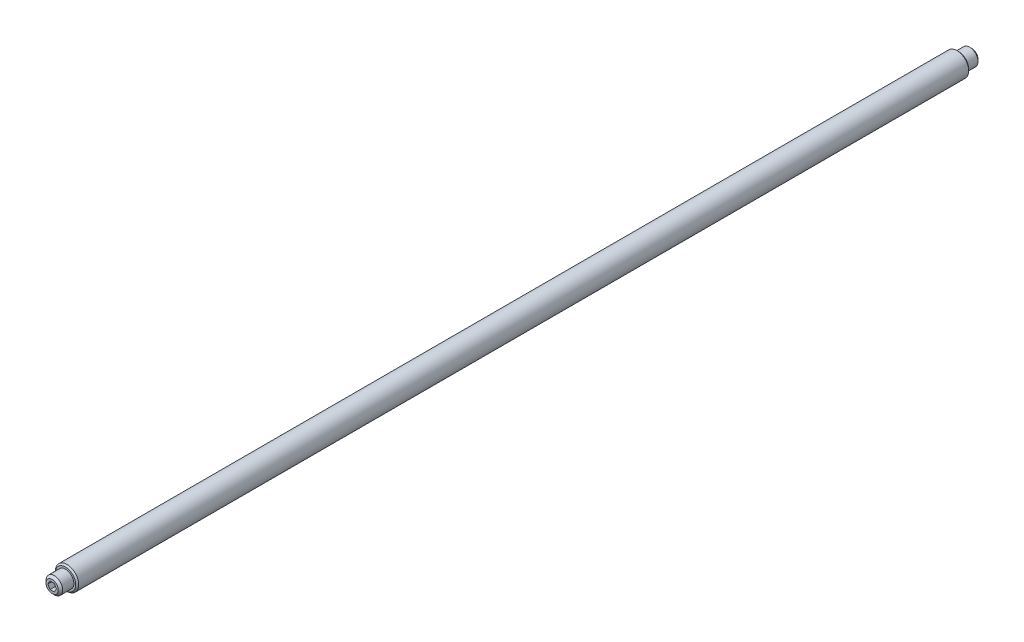
ISO-10303-21;
HEADER;
FILE_DESCRIPTION(('STEP AP214'),'2;1');
FILE_NAME('part.step','',(''),(''),'','','');
FILE_SCHEMA(('AUTOMOTIVE_DESIGN { 1 0 10303 214 1 1 1 1 }'));
ENDSEC;
DATA;
#1=APPLICATION_CONTEXT('core data for automotive mechanical design processes');
#2=APPLICATION_PROTOCOL_DEFINITION('international standard','automotive_design',2000,#1);
#3=PRODUCT_CONTEXT('',#1,'mechanical');
#4=PRODUCT('Part','Part','',(#3));
#5=PRODUCT_RELATED_PRODUCT_CATEGORY('part','',(#4));
#6=PRODUCT_DEFINITION_FORMATION('','',#4);
#7=PRODUCT_DEFINITION_CONTEXT('part definition',#1,'design');
#8=PRODUCT_DEFINITION('design','',#6,#7);
#9=PRODUCT_DEFINITION_SHAPE('','',#8);
#10=(LENGTH_UNIT() NAMED_UNIT(*) SI_UNIT(.MILLI.,.METRE.));
#11=(NAMED_UNIT(*) PLANE_ANGLE_UNIT() SI_UNIT($,.RADIAN.));
#12=(NAMED_UNIT(*) SI_UNIT($,.STERADIAN.) SOLID_ANGLE_UNIT());
#13=UNCERTAINTY_MEASURE_WITH_UNIT(LENGTH_MEASURE(1.E-05),#10,'distance_accuracy_value','');
#14=(GEOMETRIC_REPRESENTATION_CONTEXT(3) GLOBAL_UNCERTAINTY_ASSIGNED_CONTEXT((#13)) GLOBAL_UNIT_ASSIGNED_CONTEXT((#10,
#11,#12)) REPRESENTATION_CONTEXT('',''));
#15=CARTESIAN_POINT('',(0.,0.,0.));
#16=DIRECTION('',(0.,0.,1.));
#17=DIRECTION('',(1.,0.,0.));
#18=AXIS2_PLACEMENT_3D('',#15,#16,#17);
#19=CARTESIAN_POINT('',(0.,0.,-78.486));
#20=DIRECTION('',(0.,0.,-1.));
#21=DIRECTION('',(-0.998913283373913,-0.0466074275105245,0.));
#22=AXIS2_PLACEMENT_3D('',#19,#20,#21);
#23=PLANE('',#22);
#24=CARTESIAN_POINT('',(0.,0.,-78.486));
#25=DIRECTION('',(0.,0.,-1.));
#26=DIRECTION('',(-0.998913283373913,-0.0466074275105245,0.));
#27=AXIS2_PLACEMENT_3D('',#24,#25,#26);
#28=CIRCLE('',#27,1.04394);
#29=CARTESIAN_POINT('',(-1.04280553304536,-0.048655357875337,-78.486));
#30=VERTEX_POINT('',#29);
#31=EDGE_CURVE('P0_E11',#30,#30,#28,.T.);
#32=ORIENTED_EDGE('',*,*,#31,.T.);
#33=EDGE_LOOP('',(#32));
#34=FACE_BOUND('',#33,.T.);
#35=DIRECTION('',(0.998913283373913,0.0466074275105243,0.));
#36=VECTOR('',#35,1.);
#37=CARTESIAN_POINT('',(-0.395814728157853,0.617222840072096,-78.486));
#38=LINE('',#37,#36);
#39=CARTESIAN_POINT('',(-0.395814728157853,0.617222840072096,-78.486));
#40=VERTEX_POINT('',#39);
#41=CARTESIAN_POINT('',(0.336623295219484,0.651397029812781,-78.486));
#42=VERTEX_POINT('',#41);
#43=EDGE_CURVE('P0_E78',#40,#42,#38,.T.);
#44=ORIENTED_EDGE('',*,*,#43,.F.);
#45=DIRECTION('',(-0.459093425457801,-0.888387993334794,0.));
#46=VECTOR('',#45,1.);
#47=CARTESIAN_POINT('',(-0.395814728157853,0.617222840072096,-78.486));
#48=LINE('',#47,#46);
#49=CARTESIAN_POINT('',(-0.732438023377339,-0.034174189740681,-78.486));
#50=VERTEX_POINT('',#49);
#51=EDGE_CURVE('P0_E31',#40,#50,#48,.T.);
#52=ORIENTED_EDGE('',*,*,#51,.T.);
#53=DIRECTION('',(-0.539819857916113,0.84178056582427,0.));
#54=VECTOR('',#53,1.);
#55=CARTESIAN_POINT('',(-0.336623295219487,-0.651397029812773,-78.486));
#56=LINE('',#55,#54);
#57=CARTESIAN_POINT('',(-0.336623295219487,-0.651397029812773,-78.486));
#58=VERTEX_POINT('',#57);
#59=EDGE_CURVE('P0_E84',#58,#50,#56,.T.);
#60=ORIENTED_EDGE('',*,*,#59,.F.);
#61=DIRECTION('',(0.998913283373913,0.0466074275105245,0.));
#62=VECTOR('',#61,1.);
#63=CARTESIAN_POINT('',(-0.336623295219487,-0.651397029812773,-78.486));
#64=LINE('',#63,#62);
#65=CARTESIAN_POINT('',(0.395814728157851,-0.617222840072088,-78.486));
#66=VERTEX_POINT('',#65);
#67=EDGE_CURVE('P0_E104',#58,#66,#64,.T.);
#68=ORIENTED_EDGE('',*,*,#67,.T.);
#69=DIRECTION('',(0.459093425457801,0.888387993334794,0.));
#70=VECTOR('',#69,1.);
#71=CARTESIAN_POINT('',(0.395814728157851,-0.617222840072088,-78.486));
#72=LINE('',#71,#70);
#73=CARTESIAN_POINT('',(0.732438023377336,0.0341741897406895,-78.486));
#74=VERTEX_POINT('',#73);
#75=EDGE_CURVE('P0_E107',#66,#74,#72,.T.);
#76=ORIENTED_EDGE('',*,*,#75,.T.);
#77=DIRECTION('',(0.539819857916113,-0.84178056582427,0.));
#78=VECTOR('',#77,1.);
#79=CARTESIAN_POINT('',(0.336623295219484,0.651397029812781,-78.486));
#80=LINE('',#79,#78);
#81=EDGE_CURVE('P0_E110',#42,#74,#80,.T.);
#82=ORIENTED_EDGE('',*,*,#81,.F.);
#83=EDGE_LOOP('',(#44,#52,#60,#68,#76,#82));
#84=FACE_BOUND('',#83,.T.);
#85=ADVANCED_FACE('P0_F17',(#34,#84),#23,.T.);
#86=CARTESIAN_POINT('',(0.,0.,-78.486));
#87=DIRECTION('',(0.,0.,1.));
#88=DIRECTION('',(0.998913283373913,0.0466074275105245,0.));
#89=AXIS2_PLACEMENT_3D('',#86,#87,#88);
#90=CONICAL_SURFACE('',#89,1.04394,0.785398163397426);
#91=CARTESIAN_POINT('',(0.,0.,-78.10754));
#92=DIRECTION('',(0.,0.,-1.));
#93=DIRECTION('',(-0.998913283373913,-0.0466074275105245,0.));
#94=AXIS2_PLACEMENT_3D('',#91,#92,#93);
#95=CIRCLE('',#94,1.4224);
#96=CARTESIAN_POINT('',(-1.42085425427105,-0.06629440489097,-78.10754));
#97=VERTEX_POINT('',#96);
#98=EDGE_CURVE('P0_E24',#97,#97,#95,.T.);
#99=ORIENTED_EDGE('',*,*,#98,.T.);
#100=EDGE_LOOP('',(#99));
#101=FACE_BOUND('',#100,.T.);
#102=ORIENTED_EDGE('',*,*,#31,.F.);
#103=EDGE_LOOP('',(#102));
#104=FACE_BOUND('',#103,.T.);
#105=ADVANCED_FACE('P0_F130',(#101,#104),#90,.T.);
#106=CARTESIAN_POINT('',(0.,0.,-91.186));
#107=DIRECTION('',(0.,0.,-1.));
#108=DIRECTION('',(-0.998913283373913,-0.0466074275105245,0.));
#109=AXIS2_PLACEMENT_3D('',#106,#107,#108);
#110=CYLINDRICAL_SURFACE('',#109,1.4224);
#111=CARTESIAN_POINT('',(0.,0.,-72.7837));
#112=DIRECTION('',(0.,0.,-1.));
#113=DIRECTION('',(-0.998913283373913,-0.0466074275105245,0.));
#114=AXIS2_PLACEMENT_3D('',#111,#112,#113);
#115=CIRCLE('',#114,1.4224);
#116=CARTESIAN_POINT('',(-1.42085425427105,-0.06629440489097,-72.7837));
#117=VERTEX_POINT('',#116);
#118=EDGE_CURVE('P0_E125',#117,#117,#115,.T.);
#119=ORIENTED_EDGE('',*,*,#118,.T.);
#120=EDGE_LOOP('',(#119));
#121=FACE_BOUND('',#120,.T.);
#122=ORIENTED_EDGE('',*,*,#98,.F.);
#123=EDGE_LOOP('',(#122));
#124=FACE_BOUND('',#123,.T.);
#125=ADVANCED_FACE('P0_F133',(#121,#124),#110,.T.);
#126=CARTESIAN_POINT('',(0.,0.,-72.7837));
#127=DIRECTION('',(0.,0.,-1.));
#128=DIRECTION('',(-0.998913283373913,-0.0466074275105245,0.));
#129=AXIS2_PLACEMENT_3D('',#126,#127,#128);
#130=CONICAL_SURFACE('',#129,1.4224,0.785398163397453);
#131=CARTESIAN_POINT('',(0.,0.,-72.136));
#132=DIRECTION('',(0.,0.,-1.));
#133=DIRECTION('',(-0.998913283373913,-0.0466074275105245,0.));
#134=AXIS2_PLACEMENT_3D('',#131,#132,#133);
#135=CIRCLE('',#134,0.7747);
#136=CARTESIAN_POINT('',(-0.773858120629771,-0.0361067740924033,-72.136));
#137=VERTEX_POINT('',#136);
#138=EDGE_CURVE('P0_E85',#137,#137,#135,.T.);
#139=ORIENTED_EDGE('',*,*,#138,.T.);
#140=EDGE_LOOP('',(#139));
#141=FACE_BOUND('',#140,.T.);
#142=ORIENTED_EDGE('',*,*,#118,.F.);
#143=EDGE_LOOP('',(#142));
#144=FACE_BOUND('',#143,.T.);
#145=ADVANCED_FACE('P0_F135',(#141,#144),#130,.T.);
#146=CARTESIAN_POINT('',(0.,0.,-72.6014867215606));
#147=DIRECTION('',(0.,0.,1.));
#148=DIRECTION('',(0.998913283373913,0.0466074275105245,0.));
#149=AXIS2_PLACEMENT_3D('',#146,#147,#148);
#150=CONICAL_SURFACE('',#149,0.,1.02974425867666);
#151=ORIENTED_EDGE('',*,*,#138,.F.);
#152=EDGE_LOOP('',(#151));
#153=FACE_BOUND('',#152,.T.);
#154=CARTESIAN_POINT('',(0.,0.,-72.6014867215606));
#155=VERTEX_POINT('',#154);
#156=VERTEX_LOOP('',#155);
#157=FACE_BOUND('',#156,.T.);
#158=ADVANCED_FACE('P0_F143',(#153,#157),#150,.F.);
#159=CARTESIAN_POINT('',(-0.395814728157853,0.617222840072096,-76.708));
#160=DIRECTION('',(0.888387993334794,-0.459093425457801,0.));
#161=DIRECTION('',(0.459093425457801,0.888387993334795,0.));
#162=AXIS2_PLACEMENT_3D('',#159,#160,#161);
#163=PLANE('',#162);
#164=ORIENTED_EDGE('',*,*,#51,.F.);
#165=DIRECTION('',(0.,0.,-1.));
#166=VECTOR('',#165,1.);
#167=CARTESIAN_POINT('',(-0.395814728157853,0.617222840072096,-76.708));
#168=LINE('',#167,#166);
#169=CARTESIAN_POINT('',(-0.395814728157853,0.617222840072096,-76.708));
#170=VERTEX_POINT('',#169);
#171=EDGE_CURVE('P0_E72',#170,#40,#168,.T.);
#172=ORIENTED_EDGE('',*,*,#171,.F.);
#173=DIRECTION('',(-0.459093425457801,-0.888387993334794,0.));
#174=VECTOR('',#173,1.);
#175=CARTESIAN_POINT('',(-0.395814728157853,0.617222840072096,-76.708));
#176=LINE('',#175,#174);
#177=CARTESIAN_POINT('',(-0.732438023377339,-0.034174189740681,-76.708));
#178=VERTEX_POINT('',#177);
#179=EDGE_CURVE('P0_E67',#170,#178,#176,.T.);
#180=ORIENTED_EDGE('',*,*,#179,.T.);
#181=DIRECTION('',(0.,0.,-1.));
#182=VECTOR('',#181,1.);
#183=CARTESIAN_POINT('',(-0.732438023377339,-0.034174189740681,-76.708));
#184=LINE('',#183,#182);
#185=EDGE_CURVE('P0_E70',#178,#50,#184,.T.);
#186=ORIENTED_EDGE('',*,*,#185,.T.);
#187=EDGE_LOOP('',(#164,#172,#180,#186));
#188=FACE_BOUND('',#187,.T.);
#189=ADVANCED_FACE('P0_F69',(#188),#163,.T.);
#190=CARTESIAN_POINT('',(-0.336623295219487,-0.651397029812773,-76.708));
#191=DIRECTION('',(-0.84178056582427,-0.539819857916113,0.));
#192=DIRECTION('',(0.539819857916113,-0.84178056582427,0.));
#193=AXIS2_PLACEMENT_3D('',#190,#191,#192);
#194=PLANE('',#193);
#195=ORIENTED_EDGE('',*,*,#59,.T.);
#196=ORIENTED_EDGE('',*,*,#185,.F.);
#197=DIRECTION('',(-0.539819857916113,0.84178056582427,0.));
#198=VECTOR('',#197,1.);
#199=CARTESIAN_POINT('',(-0.336623295219487,-0.651397029812773,-76.708));
#200=LINE('',#199,#198);
#201=CARTESIAN_POINT('',(-0.336623295219487,-0.651397029812773,-76.708));
#202=VERTEX_POINT('',#201);
#203=EDGE_CURVE('P0_E77',#202,#178,#200,.T.);
#204=ORIENTED_EDGE('',*,*,#203,.F.);
#205=DIRECTION('',(0.,0.,-1.));
#206=VECTOR('',#205,1.);
#207=CARTESIAN_POINT('',(-0.336623295219487,-0.651397029812773,-76.708));
#208=LINE('',#207,#206);
#209=EDGE_CURVE('P0_E86',#202,#58,#208,.T.);
#210=ORIENTED_EDGE('',*,*,#209,.T.);
#211=EDGE_LOOP('',(#195,#196,#204,#210));
#212=FACE_BOUND('',#211,.T.);
#213=ADVANCED_FACE('P0_F82',(#212),#194,.F.);
#214=CARTESIAN_POINT('',(-0.336623295219487,-0.651397029812773,-76.708));
#215=DIRECTION('',(-0.0466074275105245,0.998913283373913,0.));
#216=DIRECTION('',(-0.998913283373913,-0.0466074275105245,0.));
#217=AXIS2_PLACEMENT_3D('',#214,#215,#216);
#218=PLANE('',#217);
#219=ORIENTED_EDGE('',*,*,#67,.F.);
#220=ORIENTED_EDGE('',*,*,#209,.F.);
#221=DIRECTION('',(0.998913283373913,0.0466074275105245,0.));
#222=VECTOR('',#221,1.);
#223=CARTESIAN_POINT('',(-0.336623295219487,-0.651397029812773,-76.708));
#224=LINE('',#223,#222);
#225=CARTESIAN_POINT('',(0.395814728157851,-0.617222840072088,-76.708));
#226=VERTEX_POINT('',#225);
#227=EDGE_CURVE('P0_E91',#202,#226,#224,.T.);
#228=ORIENTED_EDGE('',*,*,#227,.T.);
#229=DIRECTION('',(0.,0.,-1.));
#230=VECTOR('',#229,1.);
#231=CARTESIAN_POINT('',(0.395814728157851,-0.617222840072088,-76.708));
#232=LINE('',#231,#230);
#233=EDGE_CURVE('P0_E120',#226,#66,#232,.T.);
#234=ORIENTED_EDGE('',*,*,#233,.T.);
#235=EDGE_LOOP('',(#219,#220,#228,#234));
#236=FACE_BOUND('',#235,.T.);
#237=ADVANCED_FACE('P0_F166',(#236),#218,.T.);
#238=CARTESIAN_POINT('',(0.395814728157851,-0.617222840072088,-76.708));
#239=DIRECTION('',(-0.888387993334795,0.459093425457801,0.));
#240=DIRECTION('',(-0.459093425457801,-0.888387993334795,0.));
#241=AXIS2_PLACEMENT_3D('',#238,#239,#240);
#242=PLANE('',#241);
#243=ORIENTED_EDGE('',*,*,#75,.F.);
#244=ORIENTED_EDGE('',*,*,#233,.F.);
#245=DIRECTION('',(0.459093425457801,0.888387993334794,0.));
#246=VECTOR('',#245,1.);
#247=CARTESIAN_POINT('',(0.395814728157851,-0.617222840072088,-76.708));
#248=LINE('',#247,#246);
#249=CARTESIAN_POINT('',(0.732438023377336,0.0341741897406895,-76.708));
#250=VERTEX_POINT('',#249);
#251=EDGE_CURVE('P0_E93',#226,#250,#248,.T.);
#252=ORIENTED_EDGE('',*,*,#251,.T.);
#253=DIRECTION('',(0.,0.,-1.));
#254=VECTOR('',#253,1.);
#255=CARTESIAN_POINT('',(0.732438023377336,0.0341741897406895,-76.708));
#256=LINE('',#255,#254);
#257=EDGE_CURVE('P0_E118',#250,#74,#256,.T.);
#258=ORIENTED_EDGE('',*,*,#257,.T.);
#259=EDGE_LOOP('',(#243,#244,#252,#258));
#260=FACE_BOUND('',#259,.T.);
#261=ADVANCED_FACE('P0_F162',(#260),#242,.T.);
#262=CARTESIAN_POINT('',(0.336623295219484,0.651397029812781,-76.708));
#263=DIRECTION('',(0.84178056582427,0.539819857916113,0.));
#264=DIRECTION('',(-0.539819857916113,0.84178056582427,0.));
#265=AXIS2_PLACEMENT_3D('',#262,#263,#264);
#266=PLANE('',#265);
#267=ORIENTED_EDGE('',*,*,#81,.T.);
#268=ORIENTED_EDGE('',*,*,#257,.F.);
#269=DIRECTION('',(0.539819857916113,-0.84178056582427,0.));
#270=VECTOR('',#269,1.);
#271=CARTESIAN_POINT('',(0.336623295219484,0.651397029812781,-76.708));
#272=LINE('',#271,#270);
#273=CARTESIAN_POINT('',(0.336623295219484,0.651397029812781,-76.708));
#274=VERTEX_POINT('',#273);
#275=EDGE_CURVE('P0_E97',#274,#250,#272,.T.);
#276=ORIENTED_EDGE('',*,*,#275,.F.);
#277=DIRECTION('',(0.,0.,-1.));
#278=VECTOR('',#277,1.);
#279=CARTESIAN_POINT('',(0.336623295219484,0.651397029812781,-76.708));
#280=LINE('',#279,#278);
#281=EDGE_CURVE('P0_E116',#274,#42,#280,.T.);
#282=ORIENTED_EDGE('',*,*,#281,.T.);
#283=EDGE_LOOP('',(#267,#268,#276,#282));
#284=FACE_BOUND('',#283,.T.);
#285=ADVANCED_FACE('P0_F159',(#284),#266,.F.);
#286=CARTESIAN_POINT('',(-0.395814728157853,0.617222840072096,-76.708));
#287=DIRECTION('',(-0.0466074275105243,0.998913283373913,0.));
#288=DIRECTION('',(-0.998913283373913,-0.0466074275105243,0.));
#289=AXIS2_PLACEMENT_3D('',#286,#287,#288);
#290=PLANE('',#289);
#291=ORIENTED_EDGE('',*,*,#43,.T.);
#292=ORIENTED_EDGE('',*,*,#281,.F.);
#293=DIRECTION('',(0.998913283373913,0.0466074275105243,0.));
#294=VECTOR('',#293,1.);
#295=CARTESIAN_POINT('',(-0.395814728157853,0.617222840072096,-76.708));
#296=LINE('',#295,#294);
#297=EDGE_CURVE('P0_E100',#170,#274,#296,.T.);
#298=ORIENTED_EDGE('',*,*,#297,.F.);
#299=ORIENTED_EDGE('',*,*,#171,.T.);
#300=EDGE_LOOP('',(#291,#292,#298,#299));
#301=FACE_BOUND('',#300,.T.);
#302=ADVANCED_FACE('P0_F155',(#301),#290,.F.);
#303=CARTESIAN_POINT('',(-0.732438023377339,-0.0341741897406809,-76.708));
#304=DIRECTION('',(0.,0.,-1.));
#305=DIRECTION('',(-0.998913283373913,-0.0466074275105245,0.));
#306=AXIS2_PLACEMENT_3D('',#303,#304,#305);
#307=PLANE('',#306);
#308=ORIENTED_EDGE('',*,*,#179,.F.);
#309=ORIENTED_EDGE('',*,*,#297,.T.);
#310=ORIENTED_EDGE('',*,*,#275,.T.);
#311=ORIENTED_EDGE('',*,*,#251,.F.);
#312=ORIENTED_EDGE('',*,*,#227,.F.);
#313=ORIENTED_EDGE('',*,*,#203,.T.);
#314=EDGE_LOOP('',(#308,#309,#310,#311,#312,#313));
#315=FACE_BOUND('',#314,.T.);
#316=ADVANCED_FACE('P0_F89',(#315),#307,.T.);
#317=CLOSED_SHELL('',(#85,#105,#125,#145,#158,#189,#213,#237,#261,#285,#302,#316));
#318=MANIFOLD_SOLID_BREP('P0_B1',#317);
#319=CARTESIAN_POINT('',(0.,0.,76.2));
#320=DIRECTION('',(0.,0.,-1.));
#321=DIRECTION('',(-1.,0.,0.));
#322=AXIS2_PLACEMENT_3D('',#319,#320,#321);
#323=CYLINDRICAL_SURFACE('',#322,1.9939);
#324=CARTESIAN_POINT('',(0.,0.,-75.9459999999999));
#325=DIRECTION('',(0.,0.,1.));
#326=DIRECTION('',(1.,0.,0.));
#327=AXIS2_PLACEMENT_3D('',#324,#325,#326);
#328=CIRCLE('',#327,1.9939);
#329=CARTESIAN_POINT('',(-1.9939,0.,-75.9459999999999));
#330=VERTEX_POINT('',#329);
#331=EDGE_CURVE('P1_E25',#330,#330,#328,.T.);
#332=CARTESIAN_POINT('',(0.,0.,75.9460000000001));
#333=DIRECTION('',(0.,0.,1.));
#334=DIRECTION('',(1.,0.,0.));
#335=AXIS2_PLACEMENT_3D('',#332,#333,#334);
#336=CIRCLE('',#335,1.9939);
#337=CARTESIAN_POINT('',(-1.9939,0.,75.9460000000001));
#338=VERTEX_POINT('',#337);
#339=EDGE_CURVE('P1_E66',#338,#338,#336,.F.);
#340=CARTESIAN_POINT('',(-1.9939,0.,-75.9459999999999));
#341=CARTESIAN_POINT('',(-1.9939,0.,-74.3637916666666));
#342=CARTESIAN_POINT('',(-1.9939,0.,-72.7815833333332));
#343=CARTESIAN_POINT('',(-1.9939,0.,-69.6171666666666));
#344=CARTESIAN_POINT('',(-1.9939,0.,-68.0349583333332));
#345=CARTESIAN_POINT('',(-1.9939,0.,-64.8705416666666));
#346=CARTESIAN_POINT('',(-1.9939,0.,-63.2883333333332));
#347=CARTESIAN_POINT('',(-1.9939,0.,-60.1239166666666));
#348=CARTESIAN_POINT('',(-1.9939,0.,-58.5417083333333));
#349=CARTESIAN_POINT('',(-1.9939,0.,-55.3772916666666));
#350=CARTESIAN_POINT('',(-1.9939,0.,-53.7950833333333));
#351=CARTESIAN_POINT('',(-1.9939,0.,-50.6306666666666));
#352=CARTESIAN_POINT('',(-1.9939,0.,-49.0484583333333));
#353=CARTESIAN_POINT('',(-1.9939,0.,-45.8840416666666));
#354=CARTESIAN_POINT('',(-1.9939,0.,-44.3018333333333));
#355=CARTESIAN_POINT('',(-1.9939,0.,-41.1374166666666));
#356=CARTESIAN_POINT('',(-1.9939,0.,-39.5552083333333));
#357=CARTESIAN_POINT('',(-1.9939,0.,-36.3907916666666));
#358=CARTESIAN_POINT('',(-1.9939,0.,-34.8085833333333));
#359=CARTESIAN_POINT('',(-1.9939,0.,-31.6441666666666));
#360=CARTESIAN_POINT('',(-1.9939,0.,-30.0619583333333));
#361=CARTESIAN_POINT('',(-1.9939,0.,-26.8975416666666));
#362=CARTESIAN_POINT('',(-1.9939,0.,-25.3153333333333));
#363=CARTESIAN_POINT('',(-1.9939,0.,-22.1509166666666));
#364=CARTESIAN_POINT('',(-1.9939,0.,-20.5687083333333));
#365=CARTESIAN_POINT('',(-1.9939,0.,-17.4042916666666));
#366=CARTESIAN_POINT('',(-1.9939,0.,-15.8220833333333));
#367=CARTESIAN_POINT('',(-1.9939,0.,-12.6576666666666));
#368=CARTESIAN_POINT('',(-1.9939,0.,-11.0754583333333));
#369=CARTESIAN_POINT('',(-1.9939,0.,-7.9110416666666));
#370=CARTESIAN_POINT('',(-1.9939,0.,-6.32883333333327));
#371=CARTESIAN_POINT('',(-1.9939,0.,-3.1644166666666));
#372=CARTESIAN_POINT('',(-1.9939,0.,-1.58220833333326));
#373=CARTESIAN_POINT('',(-1.9939,0.,1.5822083333334));
#374=CARTESIAN_POINT('',(-1.9939,0.,3.16441666666674));
#375=CARTESIAN_POINT('',(-1.9939,0.,6.3288333333334));
#376=CARTESIAN_POINT('',(-1.9939,0.,7.91104166666673));
#377=CARTESIAN_POINT('',(-1.9939,0.,11.0754583333334));
#378=CARTESIAN_POINT('',(-1.9939,0.,12.6576666666667));
#379=CARTESIAN_POINT('',(-1.9939,0.,15.8220833333334));
#380=CARTESIAN_POINT('',(-1.9939,0.,17.4042916666667));
#381=CARTESIAN_POINT('',(-1.9939,0.,20.5687083333334));
#382=CARTESIAN_POINT('',(-1.9939,0.,22.1509166666667));
#383=CARTESIAN_POINT('',(-1.9939,0.,25.3153333333334));
#384=CARTESIAN_POINT('',(-1.9939,0.,26.8975416666667));
#385=CARTESIAN_POINT('',(-1.9939,0.,30.0619583333334));
#386=CARTESIAN_POINT('',(-1.9939,0.,31.6441666666667));
#387=CARTESIAN_POINT('',(-1.9939,0.,34.8085833333334));
#388=CARTESIAN_POINT('',(-1.9939,0.,36.3907916666667));
#389=CARTESIAN_POINT('',(-1.9939,0.,39.5552083333334));
#390=CARTESIAN_POINT('',(-1.9939,0.,41.1374166666667));
#391=CARTESIAN_POINT('',(-1.9939,0.,44.3018333333334));
#392=CARTESIAN_POINT('',(-1.9939,0.,45.8840416666667));
#393=CARTESIAN_POINT('',(-1.9939,0.,49.0484583333334));
#394=CARTESIAN_POINT('',(-1.9939,0.,50.6306666666667));
#395=CARTESIAN_POINT('',(-1.9939,0.,53.7950833333334));
#396=CARTESIAN_POINT('',(-1.9939,0.,55.3772916666667));
#397=CARTESIAN_POINT('',(-1.9939,0.,58.5417083333334));
#398=CARTESIAN_POINT('',(-1.9939,0.,60.1239166666667));
#399=CARTESIAN_POINT('',(-1.9939,0.,63.2883333333334));
#400=CARTESIAN_POINT('',(-1.9939,0.,64.8705416666667));
#401=CARTESIAN_POINT('',(-1.9939,0.,68.0349583333334));
#402=CARTESIAN_POINT('',(-1.9939,0.,69.6171666666667));
#403=CARTESIAN_POINT('',(-1.9939,0.,72.7815833333334));
#404=CARTESIAN_POINT('',(-1.9939,0.,74.3637916666667));
#405=CARTESIAN_POINT('',(-1.9939,0.,75.9460000000001));
#406=B_SPLINE_CURVE_WITH_KNOTS('',3,(#340,#341,#342,#343,#344,#345,#346,#347,#348,#349,#350,
#351,#352,#353,#354,#355,#356,#357,#358,#359,#360,#361,#362,#363,#364,#365,#366,#367,#368,#369,
#370,#371,#372,#373,#374,#375,#376,#377,#378,#379,#380,#381,#382,#383,#384,#385,#386,#387,#388,
#389,#390,#391,#392,#393,#394,#395,#396,#397,#398,#399,#400,#401,#402,#403,#404,#405),
.UNSPECIFIED.,.F.,.F.,(4,2,2,2,2,2,2,2,2,2,2,2,2,2,2,2,2,2,2,2,2,2,2,2,2,2,2,2,2,2,2,2,4),(0.,
4.746625,9.49325000000001,14.239875,18.9865,23.733125,28.47975,33.226375,37.973,42.719625,
47.46625,52.212875,56.9595,61.706125,66.45275,71.199375,75.946,80.692625,85.43925,90.185875,
94.9325,99.679125,104.42575,109.172375,113.919,118.665625,123.41225,128.158875,132.9055,
137.652125,142.39875,147.145375,151.892),.UNSPECIFIED.);
#407=EDGE_CURVE('P1_BSEAM17',#330,#338,#406,.T.);
#408=ORIENTED_EDGE('',*,*,#331,.T.);
#409=ORIENTED_EDGE('',*,*,#339,.T.);
#410=ORIENTED_EDGE('',*,*,#407,.T.);
#411=ORIENTED_EDGE('',*,*,#407,.F.);
#412=EDGE_LOOP('',(#408,#410,#409,#411));
#413=FACE_BOUND('',#412,.T.);
#414=ADVANCED_FACE('P1_F17',(#413),#323,.T.);
#415=CARTESIAN_POINT('',(0.,0.,76.2));
#416=DIRECTION('',(0.,0.,1.));
#417=DIRECTION('',(1.,0.,0.));
#418=AXIS2_PLACEMENT_3D('',#415,#416,#417);
#419=PLANE('',#418);
#420=CARTESIAN_POINT('',(0.,0.,76.2));
#421=DIRECTION('',(0.,0.,1.));
#422=DIRECTION('',(1.,0.,0.));
#423=AXIS2_PLACEMENT_3D('',#420,#421,#422);
#424=CIRCLE('',#423,1.42239999999999);
#425=CARTESIAN_POINT('',(1.42239999999999,0.,76.2));
#426=VERTEX_POINT('',#425);
#427=EDGE_CURVE('P1_E60',#426,#426,#424,.T.);
#428=ORIENTED_EDGE('',*,*,#427,.F.);
#429=EDGE_LOOP('',(#428));
#430=FACE_BOUND('',#429,.T.);
#431=CARTESIAN_POINT('',(0.,0.,76.2));
#432=DIRECTION('',(0.,0.,1.));
#433=DIRECTION('',(1.,0.,0.));
#434=AXIS2_PLACEMENT_3D('',#431,#432,#433);
#435=CIRCLE('',#434,1.73990000000003);
#436=CARTESIAN_POINT('',(1.73990000000003,0.,76.2));
#437=VERTEX_POINT('',#436);
#438=EDGE_CURVE('P1_E63',#437,#437,#435,.T.);
#439=ORIENTED_EDGE('',*,*,#438,.T.);
#440=EDGE_LOOP('',(#439));
#441=FACE_BOUND('',#440,.T.);
#442=ADVANCED_FACE('P1_F90',(#430,#441),#419,.T.);
#443=CARTESIAN_POINT('',(0.,0.,-76.2));
#444=DIRECTION('',(0.,0.,1.));
#445=DIRECTION('',(1.,0.,0.));
#446=AXIS2_PLACEMENT_3D('',#443,#444,#445);
#447=PLANE('',#446);
#448=CARTESIAN_POINT('',(0.,0.,-76.2));
#449=DIRECTION('',(0.,0.,-1.));
#450=DIRECTION('',(-1.,0.,0.));
#451=AXIS2_PLACEMENT_3D('',#448,#449,#450);
#452=CIRCLE('',#451,1.42239999999999);
#453=CARTESIAN_POINT('',(-1.42239999999999,0.,-76.2));
#454=VERTEX_POINT('',#453);
#455=EDGE_CURVE('P1_E48',#454,#454,#452,.T.);
#456=ORIENTED_EDGE('',*,*,#455,.F.);
#457=EDGE_LOOP('',(#456));
#458=FACE_BOUND('',#457,.T.);
#459=CARTESIAN_POINT('',(0.,0.,-76.2));
#460=DIRECTION('',(0.,0.,1.));
#461=DIRECTION('',(1.,0.,0.));
#462=AXIS2_PLACEMENT_3D('',#459,#460,#461);
#463=CIRCLE('',#462,1.73989999999988);
#464=CARTESIAN_POINT('',(1.73989999999988,0.,-76.2));
#465=VERTEX_POINT('',#464);
#466=EDGE_CURVE('P1_E11',#465,#465,#463,.F.);
#467=ORIENTED_EDGE('',*,*,#466,.T.);
#468=EDGE_LOOP('',(#467));
#469=FACE_BOUND('',#468,.T.);
#470=ADVANCED_FACE('P1_F86',(#458,#469),#447,.F.);
#471=CARTESIAN_POINT('',(0.,0.,76.2));
#472=DIRECTION('',(0.,0.,-1.));
#473=DIRECTION('',(-1.,0.,0.));
#474=AXIS2_PLACEMENT_3D('',#471,#472,#473);
#475=CONICAL_SURFACE('',#474,1.73990000000003,0.78539816339749);
#476=ORIENTED_EDGE('',*,*,#339,.F.);
#477=EDGE_LOOP('',(#476));
#478=FACE_BOUND('',#477,.T.);
#479=ORIENTED_EDGE('',*,*,#438,.F.);
#480=EDGE_LOOP('',(#479));
#481=FACE_BOUND('',#480,.T.);
#482=ADVANCED_FACE('P1_F75',(#478,#481),#475,.T.);
#483=CARTESIAN_POINT('',(0.,0.,-75.9459999999999));
#484=DIRECTION('',(0.,0.,1.));
#485=DIRECTION('',(1.,0.,0.));
#486=AXIS2_PLACEMENT_3D('',#483,#484,#485);
#487=CONICAL_SURFACE('',#486,1.9939,0.785398163397463);
#488=ORIENTED_EDGE('',*,*,#466,.F.);
#489=EDGE_LOOP('',(#488));
#490=FACE_BOUND('',#489,.T.);
#491=ORIENTED_EDGE('',*,*,#331,.F.);
#492=EDGE_LOOP('',(#491));
#493=FACE_BOUND('',#492,.T.);
#494=ADVANCED_FACE('P1_F19',(#490,#493),#487,.T.);
#495=CARTESIAN_POINT('',(0.,0.,76.2));
#496=DIRECTION('',(0.,0.,1.));
#497=DIRECTION('',(1.,0.,0.));
#498=AXIS2_PLACEMENT_3D('',#495,#496,#497);
#499=CYLINDRICAL_SURFACE('',#498,1.4224);
#500=CARTESIAN_POINT('',(0.,0.,72.136));
#501=DIRECTION('',(0.,0.,1.));
#502=DIRECTION('',(1.,0.,0.));
#503=AXIS2_PLACEMENT_3D('',#500,#501,#502);
#504=CIRCLE('',#503,1.4224);
#505=CARTESIAN_POINT('',(1.4224,0.,72.136));
#506=VERTEX_POINT('',#505);
#507=EDGE_CURVE('P1_E57',#506,#506,#504,.T.);
#508=ORIENTED_EDGE('',*,*,#507,.F.);
#509=EDGE_LOOP('',(#508));
#510=FACE_BOUND('',#509,.T.);
#511=ORIENTED_EDGE('',*,*,#427,.T.);
#512=EDGE_LOOP('',(#511));
#513=FACE_BOUND('',#512,.T.);
#514=ADVANCED_FACE('P1_F74',(#510,#513),#499,.F.);
#515=CARTESIAN_POINT('',(1.1303,0.,72.136));
#516=DIRECTION('',(0.,0.,-1.));
#517=DIRECTION('',(-1.,0.,0.));
#518=AXIS2_PLACEMENT_3D('',#515,#516,#517);
#519=PLANE('',#518);
#520=CARTESIAN_POINT('',(0.,0.,72.136));
#521=DIRECTION('',(0.,0.,1.));
#522=DIRECTION('',(1.,0.,0.));
#523=AXIS2_PLACEMENT_3D('',#520,#521,#522);
#524=CIRCLE('',#523,1.1303);
#525=CARTESIAN_POINT('',(1.1303,0.,72.136));
#526=VERTEX_POINT('',#525);
#527=EDGE_CURVE('P1_E54',#526,#526,#524,.T.);
#528=ORIENTED_EDGE('',*,*,#527,.F.);
#529=EDGE_LOOP('',(#528));
#530=FACE_BOUND('',#529,.T.);
#531=ORIENTED_EDGE('',*,*,#507,.T.);
#532=EDGE_LOOP('',(#531));
#533=FACE_BOUND('',#532,.T.);
#534=ADVANCED_FACE('P1_F83',(#530,#533),#519,.F.);
#535=CARTESIAN_POINT('',(0.,0.,76.2));
#536=DIRECTION('',(0.,0.,1.));
#537=DIRECTION('',(1.,0.,0.));
#538=AXIS2_PLACEMENT_3D('',#535,#536,#537);
#539=CYLINDRICAL_SURFACE('',#538,1.1303);
#540=CARTESIAN_POINT('',(0.,0.,71.12));
#541=DIRECTION('',(0.,0.,1.));
#542=DIRECTION('',(1.,0.,0.));
#543=AXIS2_PLACEMENT_3D('',#540,#541,#542);
#544=CIRCLE('',#543,1.1303);
#545=CARTESIAN_POINT('',(1.1303,0.,71.12));
#546=VERTEX_POINT('',#545);
#547=EDGE_CURVE('P1_E51',#546,#546,#544,.T.);
#548=ORIENTED_EDGE('',*,*,#547,.F.);
#549=EDGE_LOOP('',(#548));
#550=FACE_BOUND('',#549,.T.);
#551=ORIENTED_EDGE('',*,*,#527,.T.);
#552=EDGE_LOOP('',(#551));
#553=FACE_BOUND('',#552,.T.);
#554=ADVANCED_FACE('P1_F104',(#550,#553),#539,.F.);
#555=CARTESIAN_POINT('',(0.,0.,71.12));
#556=DIRECTION('',(0.,0.,1.));
#557=DIRECTION('',(1.,0.,0.));
#558=AXIS2_PLACEMENT_3D('',#555,#556,#557);
#559=CONICAL_SURFACE('',#558,1.1303,1.02974425867666);
#560=CARTESIAN_POINT('',(0.,0.,70.4408472423132));
#561=VERTEX_POINT('',#560);
#562=VERTEX_LOOP('',#561);
#563=FACE_BOUND('',#562,.T.);
#564=ORIENTED_EDGE('',*,*,#547,.T.);
#565=EDGE_LOOP('',(#564));
#566=FACE_BOUND('',#565,.T.);
#567=ADVANCED_FACE('P1_F108',(#563,#566),#559,.F.);
#568=CARTESIAN_POINT('',(0.,0.,-76.2));
#569=DIRECTION('',(0.,0.,-1.));
#570=DIRECTION('',(-1.,0.,0.));
#571=AXIS2_PLACEMENT_3D('',#568,#569,#570);
#572=CYLINDRICAL_SURFACE('',#571,1.4224);
#573=CARTESIAN_POINT('',(0.,0.,-72.136));
#574=DIRECTION('',(0.,0.,-1.));
#575=DIRECTION('',(-1.,0.,0.));
#576=AXIS2_PLACEMENT_3D('',#573,#574,#575);
#577=CIRCLE('',#576,1.4224);
#578=CARTESIAN_POINT('',(-1.4224,0.,-72.136));
#579=VERTEX_POINT('',#578);
#580=EDGE_CURVE('P1_E43',#579,#579,#577,.T.);
#581=ORIENTED_EDGE('',*,*,#580,.F.);
#582=EDGE_LOOP('',(#581));
#583=FACE_BOUND('',#582,.T.);
#584=ORIENTED_EDGE('',*,*,#455,.T.);
#585=EDGE_LOOP('',(#584));
#586=FACE_BOUND('',#585,.T.);
#587=ADVANCED_FACE('P1_F112',(#583,#586),#572,.F.);
#588=CARTESIAN_POINT('',(1.1303,0.,-72.136));
#589=DIRECTION('',(0.,0.,1.));
#590=DIRECTION('',(1.,0.,0.));
#591=AXIS2_PLACEMENT_3D('',#588,#589,#590);
#592=PLANE('',#591);
#593=CARTESIAN_POINT('',(0.,0.,-72.136));
#594=DIRECTION('',(0.,0.,-1.));
#595=DIRECTION('',(-1.,0.,0.));
#596=AXIS2_PLACEMENT_3D('',#593,#594,#595);
#597=CIRCLE('',#596,1.1303);
#598=CARTESIAN_POINT('',(-1.1303,0.,-72.136));
#599=VERTEX_POINT('',#598);
#600=EDGE_CURVE('P1_E40',#599,#599,#597,.T.);
#601=ORIENTED_EDGE('',*,*,#600,.F.);
#602=EDGE_LOOP('',(#601));
#603=FACE_BOUND('',#602,.T.);
#604=ORIENTED_EDGE('',*,*,#580,.T.);
#605=EDGE_LOOP('',(#604));
#606=FACE_BOUND('',#605,.T.);
#607=ADVANCED_FACE('P1_F115',(#603,#606),#592,.F.);
#608=CARTESIAN_POINT('',(0.,0.,-76.2));
#609=DIRECTION('',(0.,0.,-1.));
#610=DIRECTION('',(-1.,0.,0.));
#611=AXIS2_PLACEMENT_3D('',#608,#609,#610);
#612=CYLINDRICAL_SURFACE('',#611,1.1303);
#613=CARTESIAN_POINT('',(0.,0.,-71.12));
#614=DIRECTION('',(0.,0.,-1.));
#615=DIRECTION('',(-1.,0.,0.));
#616=AXIS2_PLACEMENT_3D('',#613,#614,#615);
#617=CIRCLE('',#616,1.1303);
#618=CARTESIAN_POINT('',(-1.1303,0.,-71.12));
#619=VERTEX_POINT('',#618);
#620=EDGE_CURVE('P1_E38',#619,#619,#617,.T.);
#621=ORIENTED_EDGE('',*,*,#620,.F.);
#622=EDGE_LOOP('',(#621));
#623=FACE_BOUND('',#622,.T.);
#624=ORIENTED_EDGE('',*,*,#600,.T.);
#625=EDGE_LOOP('',(#624));
#626=FACE_BOUND('',#625,.T.);
#627=ADVANCED_FACE('P1_F34',(#623,#626),#612,.F.);
#628=CARTESIAN_POINT('',(0.,0.,-71.12));
#629=DIRECTION('',(0.,0.,-1.));
#630=DIRECTION('',(-1.,0.,0.));
#631=AXIS2_PLACEMENT_3D('',#628,#629,#630);
#632=CONICAL_SURFACE('',#631,1.1303,1.02974425867666);
#633=CARTESIAN_POINT('',(0.,0.,-70.4408472423132));
#634=VERTEX_POINT('',#633);
#635=VERTEX_LOOP('',#634);
#636=FACE_BOUND('',#635,.T.);
#637=ORIENTED_EDGE('',*,*,#620,.T.);
#638=EDGE_LOOP('',(#637));
#639=FACE_BOUND('',#638,.T.);
#640=ADVANCED_FACE('P1_F31',(#636,#639),#632,.F.);
#641=CLOSED_SHELL('',(#414,#442,#470,#482,#494,#514,#534,#554,#567,#587,#607,#627,#640));
#642=MANIFOLD_SOLID_BREP('P1_B1',#641);
#643=CARTESIAN_POINT('',(0.,0.,78.486));
#644=DIRECTION('',(0.,0.,1.));
#645=DIRECTION('',(0.999996503868046,0.00264428661179631,0.));
#646=AXIS2_PLACEMENT_3D('',#643,#644,#645);
#647=PLANE('',#646);
#648=CARTESIAN_POINT('',(0.,0.,78.486));
#649=DIRECTION('',(0.,0.,1.));
#650=DIRECTION('',(0.999996503868046,0.00264428661179631,0.));
#651=AXIS2_PLACEMENT_3D('',#648,#649,#650);
#652=CIRCLE('',#651,1.04394);
#653=CARTESIAN_POINT('',(1.04393635024801,0.00276047656551881,78.486));
#654=VERTEX_POINT('',#653);
#655=EDGE_CURVE('P2_E10',#654,#654,#652,.T.);
#656=ORIENTED_EDGE('',*,*,#655,.T.);
#657=EDGE_LOOP('',(#656));
#658=FACE_BOUND('',#657,.T.);
#659=DIRECTION('',(-0.999996503868046,-0.00264428661179646,0.));
#660=VECTOR('',#659,1.);
#661=CARTESIAN_POINT('',(0.364937017194042,0.635967221494044,78.486));
#662=LINE('',#661,#660);
#663=CARTESIAN_POINT('',(0.364937017194042,0.635967221494044,78.486));
#664=VERTEX_POINT('',#663);
#665=CARTESIAN_POINT('',(-0.368295261191022,0.634028338418383,78.486));
#666=VERTEX_POINT('',#665);
#667=EDGE_CURVE('P2_E77',#664,#666,#662,.T.);
#668=ORIENTED_EDGE('',*,*,#667,.F.);
#669=DIRECTION('',(0.502288271314726,-0.864700232739453,0.));
#670=VECTOR('',#669,1.);
#671=CARTESIAN_POINT('',(0.364937017194042,0.635967221494044,78.486));
#672=LINE('',#671,#670);
#673=CARTESIAN_POINT('',(0.733232278385065,0.00193888307566616,78.486));
#674=VERTEX_POINT('',#673);
#675=EDGE_CURVE('P2_E30',#664,#674,#672,.T.);
#676=ORIENTED_EDGE('',*,*,#675,.T.);
#677=DIRECTION('',(0.49770823255332,0.867344519351249,0.));
#678=VECTOR('',#677,1.);
#679=CARTESIAN_POINT('',(0.368295261191023,-0.634028338418374,78.486));
#680=LINE('',#679,#678);
#681=CARTESIAN_POINT('',(0.368295261191023,-0.634028338418374,78.486));
#682=VERTEX_POINT('',#681);
#683=EDGE_CURVE('P2_E83',#682,#674,#680,.T.);
#684=ORIENTED_EDGE('',*,*,#683,.F.);
#685=DIRECTION('',(-0.999996503868046,-0.00264428661179631,0.));
#686=VECTOR('',#685,1.);
#687=CARTESIAN_POINT('',(0.368295261191023,-0.634028338418374,78.486));
#688=LINE('',#687,#686);
#689=CARTESIAN_POINT('',(-0.364937017194041,-0.635967221494035,78.486));
#690=VERTEX_POINT('',#689);
#691=EDGE_CURVE('P2_E103',#682,#690,#688,.T.);
#692=ORIENTED_EDGE('',*,*,#691,.T.);
#693=DIRECTION('',(-0.502288271314726,0.864700232739453,0.));
#694=VECTOR('',#693,1.);
#695=CARTESIAN_POINT('',(-0.364937017194041,-0.635967221494035,78.486));
#696=LINE('',#695,#694);
#697=CARTESIAN_POINT('',(-0.733232278385063,-0.00193888307565723,78.486));
#698=VERTEX_POINT('',#697);
#699=EDGE_CURVE('P2_E106',#690,#698,#696,.T.);
#700=ORIENTED_EDGE('',*,*,#699,.T.);
#701=DIRECTION('',(-0.49770823255332,-0.867344519351249,0.));
#702=VECTOR('',#701,1.);
#703=CARTESIAN_POINT('',(-0.368295261191022,0.634028338418383,78.486));
#704=LINE('',#703,#702);
#705=EDGE_CURVE('P2_E109',#666,#698,#704,.T.);
#706=ORIENTED_EDGE('',*,*,#705,.F.);
#707=EDGE_LOOP('',(#668,#676,#684,#692,#700,#706));
#708=FACE_BOUND('',#707,.T.);
#709=ADVANCED_FACE('P2_F16',(#658,#708),#647,.T.);
#710=CARTESIAN_POINT('',(0.,0.,78.486));
#711=DIRECTION('',(0.,0.,-1.));
#712=DIRECTION('',(-0.999996503868046,-0.00264428661179631,0.));
#713=AXIS2_PLACEMENT_3D('',#710,#711,#712);
#714=CONICAL_SURFACE('',#713,1.04394,0.785398163397426);
#715=CARTESIAN_POINT('',(0.,0.,78.10754));
#716=DIRECTION('',(0.,0.,1.));
#717=DIRECTION('',(0.999996503868046,0.00264428661179631,0.));
#718=AXIS2_PLACEMENT_3D('',#715,#716,#717);
#719=CIRCLE('',#718,1.4224);
#720=CARTESIAN_POINT('',(1.42239502710191,0.00376123327661925,78.10754));
#721=VERTEX_POINT('',#720);
#722=EDGE_CURVE('P2_E23',#721,#721,#719,.T.);
#723=ORIENTED_EDGE('',*,*,#722,.T.);
#724=EDGE_LOOP('',(#723));
#725=FACE_BOUND('',#724,.T.);
#726=ORIENTED_EDGE('',*,*,#655,.F.);
#727=EDGE_LOOP('',(#726));
#728=FACE_BOUND('',#727,.T.);
#729=ADVANCED_FACE('P2_F129',(#725,#728),#714,.T.);
#730=CARTESIAN_POINT('',(0.,0.,91.186));
#731=DIRECTION('',(0.,0.,1.));
#732=DIRECTION('',(0.999996503868046,0.00264428661179631,0.));
#733=AXIS2_PLACEMENT_3D('',#730,#731,#732);
#734=CYLINDRICAL_SURFACE('',#733,1.4224);
#735=CARTESIAN_POINT('',(0.,0.,72.7837));
#736=DIRECTION('',(0.,0.,1.));
#737=DIRECTION('',(0.999996503868046,0.00264428661179631,0.));
#738=AXIS2_PLACEMENT_3D('',#735,#736,#737);
#739=CIRCLE('',#738,1.4224);
#740=CARTESIAN_POINT('',(1.42239502710191,0.00376123327661932,72.7837));
#741=VERTEX_POINT('',#740);
#742=EDGE_CURVE('P2_E124',#741,#741,#739,.T.);
#743=ORIENTED_EDGE('',*,*,#742,.T.);
#744=EDGE_LOOP('',(#743));
#745=FACE_BOUND('',#744,.T.);
#746=ORIENTED_EDGE('',*,*,#722,.F.);
#747=EDGE_LOOP('',(#746));
#748=FACE_BOUND('',#747,.T.);
#749=ADVANCED_FACE('P2_F132',(#745,#748),#734,.T.);
#750=CARTESIAN_POINT('',(0.,0.,72.7837));
#751=DIRECTION('',(0.,0.,1.));
#752=DIRECTION('',(0.999996503868046,0.00264428661179631,0.));
#753=AXIS2_PLACEMENT_3D('',#750,#751,#752);
#754=CONICAL_SURFACE('',#753,1.4224,0.785398163397453);
#755=CARTESIAN_POINT('',(0.,0.,72.136));
#756=DIRECTION('',(0.,0.,1.));
#757=DIRECTION('',(0.999996503868046,0.00264428661179631,0.));
#758=AXIS2_PLACEMENT_3D('',#755,#756,#757);
#759=CIRCLE('',#758,0.7747);
#760=CARTESIAN_POINT('',(0.774697291546575,0.00204852883815886,72.136));
#761=VERTEX_POINT('',#760);
#762=EDGE_CURVE('P2_E84',#761,#761,#759,.T.);
#763=ORIENTED_EDGE('',*,*,#762,.T.);
#764=EDGE_LOOP('',(#763));
#765=FACE_BOUND('',#764,.T.);
#766=ORIENTED_EDGE('',*,*,#742,.F.);
#767=EDGE_LOOP('',(#766));
#768=FACE_BOUND('',#767,.T.);
#769=ADVANCED_FACE('P2_F134',(#765,#768),#754,.T.);
#770=CARTESIAN_POINT('',(0.,0.,72.6014867215606));
#771=DIRECTION('',(0.,0.,-1.));
#772=DIRECTION('',(-0.999996503868046,-0.00264428661179631,0.));
#773=AXIS2_PLACEMENT_3D('',#770,#771,#772);
#774=CONICAL_SURFACE('',#773,0.,1.02974425867666);
#775=ORIENTED_EDGE('',*,*,#762,.F.);
#776=EDGE_LOOP('',(#775));
#777=FACE_BOUND('',#776,.T.);
#778=CARTESIAN_POINT('',(0.,0.,72.6014867215606));
#779=VERTEX_POINT('',#778);
#780=VERTEX_LOOP('',#779);
#781=FACE_BOUND('',#780,.T.);
#782=ADVANCED_FACE('P2_F142',(#777,#781),#774,.F.);
#783=CARTESIAN_POINT('',(0.364937017194042,0.635967221494044,76.708));
#784=DIRECTION('',(-0.864700232739453,-0.502288271314726,0.));
#785=DIRECTION('',(-0.502288271314726,0.864700232739453,0.));
#786=AXIS2_PLACEMENT_3D('',#783,#784,#785);
#787=PLANE('',#786);
#788=ORIENTED_EDGE('',*,*,#675,.F.);
#789=DIRECTION('',(0.,0.,1.));
#790=VECTOR('',#789,1.);
#791=CARTESIAN_POINT('',(0.364937017194042,0.635967221494044,76.708));
#792=LINE('',#791,#790);
#793=CARTESIAN_POINT('',(0.364937017194042,0.635967221494044,76.708));
#794=VERTEX_POINT('',#793);
#795=EDGE_CURVE('P2_E71',#794,#664,#792,.T.);
#796=ORIENTED_EDGE('',*,*,#795,.F.);
#797=DIRECTION('',(0.502288271314726,-0.864700232739453,0.));
#798=VECTOR('',#797,1.);
#799=CARTESIAN_POINT('',(0.364937017194042,0.635967221494044,76.708));
#800=LINE('',#799,#798);
#801=CARTESIAN_POINT('',(0.733232278385065,0.00193888307566618,76.708));
#802=VERTEX_POINT('',#801);
#803=EDGE_CURVE('P2_E66',#794,#802,#800,.T.);
#804=ORIENTED_EDGE('',*,*,#803,.T.);
#805=DIRECTION('',(0.,0.,1.));
#806=VECTOR('',#805,1.);
#807=CARTESIAN_POINT('',(0.733232278385065,0.00193888307566618,76.708));
#808=LINE('',#807,#806);
#809=EDGE_CURVE('P2_E69',#802,#674,#808,.T.);
#810=ORIENTED_EDGE('',*,*,#809,.T.);
#811=EDGE_LOOP('',(#788,#796,#804,#810));
#812=FACE_BOUND('',#811,.T.);
#813=ADVANCED_FACE('P2_F68',(#812),#787,.T.);
#814=CARTESIAN_POINT('',(0.368295261191023,-0.634028338418374,76.708));
#815=DIRECTION('',(0.867344519351249,-0.49770823255332,0.));
#816=DIRECTION('',(-0.497708232553321,-0.86734451935125,0.));
#817=AXIS2_PLACEMENT_3D('',#814,#815,#816);
#818=PLANE('',#817);
#819=ORIENTED_EDGE('',*,*,#683,.T.);
#820=ORIENTED_EDGE('',*,*,#809,.F.);
#821=DIRECTION('',(0.49770823255332,0.867344519351249,0.));
#822=VECTOR('',#821,1.);
#823=CARTESIAN_POINT('',(0.368295261191023,-0.634028338418374,76.708));
#824=LINE('',#823,#822);
#825=CARTESIAN_POINT('',(0.368295261191023,-0.634028338418374,76.708));
#826=VERTEX_POINT('',#825);
#827=EDGE_CURVE('P2_E76',#826,#802,#824,.T.);
#828=ORIENTED_EDGE('',*,*,#827,.F.);
#829=DIRECTION('',(0.,0.,1.));
#830=VECTOR('',#829,1.);
#831=CARTESIAN_POINT('',(0.368295261191023,-0.634028338418374,76.708));
#832=LINE('',#831,#830);
#833=EDGE_CURVE('P2_E85',#826,#682,#832,.T.);
#834=ORIENTED_EDGE('',*,*,#833,.T.);
#835=EDGE_LOOP('',(#819,#820,#828,#834));
#836=FACE_BOUND('',#835,.T.);
#837=ADVANCED_FACE('P2_F81',(#836),#818,.F.);
#838=CARTESIAN_POINT('',(0.368295261191023,-0.634028338418374,76.708));
#839=DIRECTION('',(-0.00264428661179631,0.999996503868046,0.));
#840=DIRECTION('',(0.999996503868046,0.00264428661179631,0.));
#841=AXIS2_PLACEMENT_3D('',#838,#839,#840);
#842=PLANE('',#841);
#843=ORIENTED_EDGE('',*,*,#691,.F.);
#844=ORIENTED_EDGE('',*,*,#833,.F.);
#845=DIRECTION('',(-0.999996503868046,-0.00264428661179631,0.));
#846=VECTOR('',#845,1.);
#847=CARTESIAN_POINT('',(0.368295261191023,-0.634028338418374,76.708));
#848=LINE('',#847,#846);
#849=CARTESIAN_POINT('',(-0.364937017194041,-0.635967221494035,76.708));
#850=VERTEX_POINT('',#849);
#851=EDGE_CURVE('P2_E90',#826,#850,#848,.T.);
#852=ORIENTED_EDGE('',*,*,#851,.T.);
#853=DIRECTION('',(0.,0.,1.));
#854=VECTOR('',#853,1.);
#855=CARTESIAN_POINT('',(-0.364937017194041,-0.635967221494035,76.708));
#856=LINE('',#855,#854);
#857=EDGE_CURVE('P2_E119',#850,#690,#856,.T.);
#858=ORIENTED_EDGE('',*,*,#857,.T.);
#859=EDGE_LOOP('',(#843,#844,#852,#858));
#860=FACE_BOUND('',#859,.T.);
#861=ADVANCED_FACE('P2_F165',(#860),#842,.T.);
#862=CARTESIAN_POINT('',(-0.364937017194041,-0.635967221494035,76.708));
#863=DIRECTION('',(0.864700232739453,0.502288271314726,0.));
#864=DIRECTION('',(0.502288271314726,-0.864700232739453,0.));
#865=AXIS2_PLACEMENT_3D('',#862,#863,#864);
#866=PLANE('',#865);
#867=ORIENTED_EDGE('',*,*,#699,.F.);
#868=ORIENTED_EDGE('',*,*,#857,.F.);
#869=DIRECTION('',(-0.502288271314726,0.864700232739453,0.));
#870=VECTOR('',#869,1.);
#871=CARTESIAN_POINT('',(-0.364937017194041,-0.635967221494035,76.708));
#872=LINE('',#871,#870);
#873=CARTESIAN_POINT('',(-0.733232278385063,-0.00193888307565721,76.708));
#874=VERTEX_POINT('',#873);
#875=EDGE_CURVE('P2_E92',#850,#874,#872,.T.);
#876=ORIENTED_EDGE('',*,*,#875,.T.);
#877=DIRECTION('',(0.,0.,1.));
#878=VECTOR('',#877,1.);
#879=CARTESIAN_POINT('',(-0.733232278385063,-0.00193888307565721,76.708));
#880=LINE('',#879,#878);
#881=EDGE_CURVE('P2_E117',#874,#698,#880,.T.);
#882=ORIENTED_EDGE('',*,*,#881,.T.);
#883=EDGE_LOOP('',(#867,#868,#876,#882));
#884=FACE_BOUND('',#883,.T.);
#885=ADVANCED_FACE('P2_F161',(#884),#866,.T.);
#886=CARTESIAN_POINT('',(-0.368295261191022,0.634028338418383,76.708));
#887=DIRECTION('',(-0.86734451935125,0.49770823255332,0.));
#888=DIRECTION('',(0.49770823255332,0.86734451935125,0.));
#889=AXIS2_PLACEMENT_3D('',#886,#887,#888);
#890=PLANE('',#889);
#891=ORIENTED_EDGE('',*,*,#705,.T.);
#892=ORIENTED_EDGE('',*,*,#881,.F.);
#893=DIRECTION('',(-0.49770823255332,-0.867344519351249,0.));
#894=VECTOR('',#893,1.);
#895=CARTESIAN_POINT('',(-0.368295261191022,0.634028338418383,76.708));
#896=LINE('',#895,#894);
#897=CARTESIAN_POINT('',(-0.368295261191022,0.634028338418383,76.708));
#898=VERTEX_POINT('',#897);
#899=EDGE_CURVE('P2_E96',#898,#874,#896,.T.);
#900=ORIENTED_EDGE('',*,*,#899,.F.);
#901=DIRECTION('',(0.,0.,1.));
#902=VECTOR('',#901,1.);
#903=CARTESIAN_POINT('',(-0.368295261191022,0.634028338418383,76.708));
#904=LINE('',#903,#902);
#905=EDGE_CURVE('P2_E115',#898,#666,#904,.T.);
#906=ORIENTED_EDGE('',*,*,#905,.T.);
#907=EDGE_LOOP('',(#891,#892,#900,#906));
#908=FACE_BOUND('',#907,.T.);
#909=ADVANCED_FACE('P2_F158',(#908),#890,.F.);
#910=CARTESIAN_POINT('',(0.364937017194042,0.635967221494044,76.708));
#911=DIRECTION('',(-0.00264428661179646,0.999996503868046,0.));
#912=DIRECTION('',(0.999996503868046,0.00264428661179646,0.));
#913=AXIS2_PLACEMENT_3D('',#910,#911,#912);
#914=PLANE('',#913);
#915=ORIENTED_EDGE('',*,*,#667,.T.);
#916=ORIENTED_EDGE('',*,*,#905,.F.);
#917=DIRECTION('',(-0.999996503868046,-0.00264428661179646,0.));
#918=VECTOR('',#917,1.);
#919=CARTESIAN_POINT('',(0.364937017194042,0.635967221494044,76.708));
#920=LINE('',#919,#918);
#921=EDGE_CURVE('P2_E99',#794,#898,#920,.T.);
#922=ORIENTED_EDGE('',*,*,#921,.F.);
#923=ORIENTED_EDGE('',*,*,#795,.T.);
#924=EDGE_LOOP('',(#915,#916,#922,#923));
#925=FACE_BOUND('',#924,.T.);
#926=ADVANCED_FACE('P2_F154',(#925),#914,.F.);
#927=CARTESIAN_POINT('',(0.733232278385065,0.00193888307566625,76.708));
#928=DIRECTION('',(0.,0.,1.));
#929=DIRECTION('',(0.999996503868046,0.00264428661179631,0.));
#930=AXIS2_PLACEMENT_3D('',#927,#928,#929);
#931=PLANE('',#930);
#932=ORIENTED_EDGE('',*,*,#803,.F.);
#933=ORIENTED_EDGE('',*,*,#921,.T.);
#934=ORIENTED_EDGE('',*,*,#899,.T.);
#935=ORIENTED_EDGE('',*,*,#875,.F.);
#936=ORIENTED_EDGE('',*,*,#851,.F.);
#937=ORIENTED_EDGE('',*,*,#827,.T.);
#938=EDGE_LOOP('',(#932,#933,#934,#935,#936,#937));
#939=FACE_BOUND('',#938,.T.);
#940=ADVANCED_FACE('P2_F88',(#939),#931,.T.);
#941=CLOSED_SHELL('',(#709,#729,#749,#769,#782,#813,#837,#861,#885,#909,#926,#940));
#942=MANIFOLD_SOLID_BREP('P2_B1',#941);
#943=ADVANCED_BREP_SHAPE_REPRESENTATION('',(#18,#318,#642,#942),#14);
#944=SHAPE_DEFINITION_REPRESENTATION(#9,#943);
ENDSEC;
END-ISO-10303-21;
